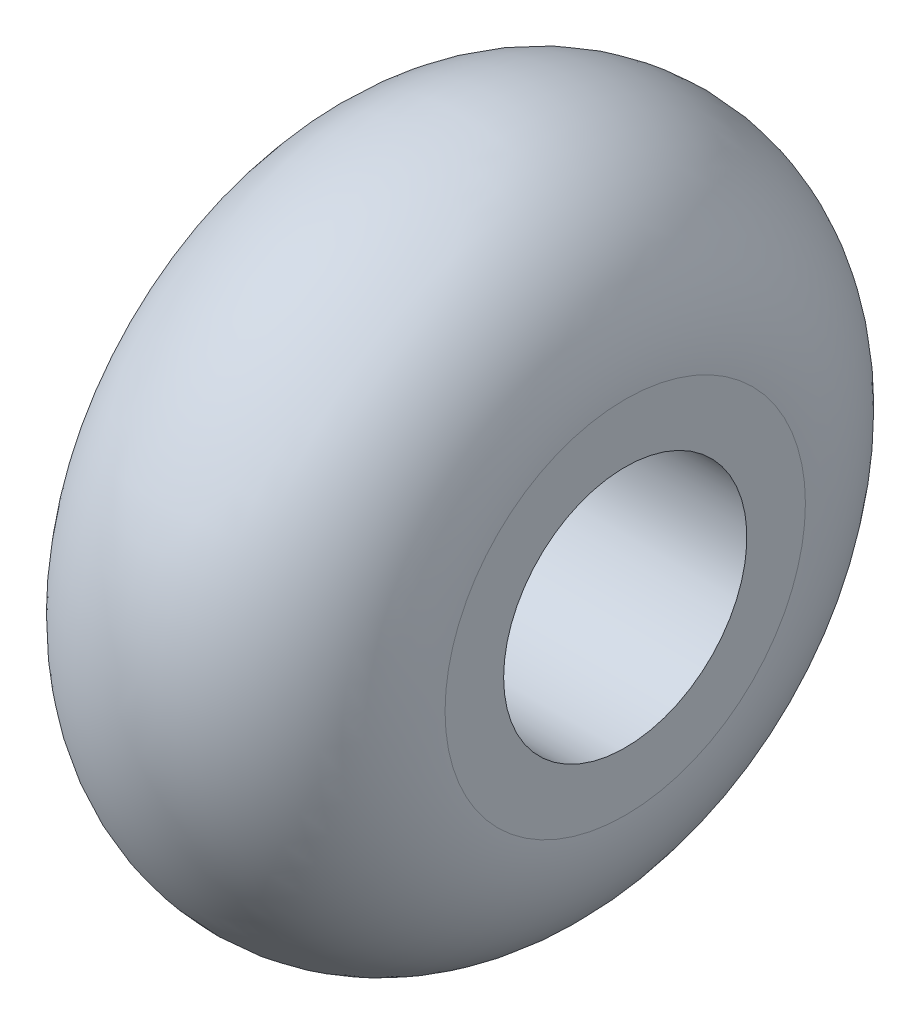
ISO-10303-21;
HEADER;
FILE_DESCRIPTION(('STEP AP214'),'2;1');
FILE_NAME('part.step','',(''),(''),'','','');
FILE_SCHEMA(('AUTOMOTIVE_DESIGN { 1 0 10303 214 1 1 1 1 }'));
ENDSEC;
DATA;
#1=APPLICATION_CONTEXT('core data for automotive mechanical design processes');
#2=APPLICATION_PROTOCOL_DEFINITION('international standard','automotive_design',2000,#1);
#3=PRODUCT_CONTEXT('',#1,'mechanical');
#4=PRODUCT('Part','Part','',(#3));
#5=PRODUCT_RELATED_PRODUCT_CATEGORY('part','',(#4));
#6=PRODUCT_DEFINITION_FORMATION('','',#4);
#7=PRODUCT_DEFINITION_CONTEXT('part definition',#1,'design');
#8=PRODUCT_DEFINITION('design','',#6,#7);
#9=PRODUCT_DEFINITION_SHAPE('','',#8);
#10=(LENGTH_UNIT() NAMED_UNIT(*) SI_UNIT(.MILLI.,.METRE.));
#11=(NAMED_UNIT(*) PLANE_ANGLE_UNIT() SI_UNIT($,.RADIAN.));
#12=(NAMED_UNIT(*) SI_UNIT($,.STERADIAN.) SOLID_ANGLE_UNIT());
#13=UNCERTAINTY_MEASURE_WITH_UNIT(LENGTH_MEASURE(1.E-05),#10,'distance_accuracy_value','');
#14=(GEOMETRIC_REPRESENTATION_CONTEXT(3) GLOBAL_UNCERTAINTY_ASSIGNED_CONTEXT((#13)) GLOBAL_UNIT_ASSIGNED_CONTEXT((#10,
#11,#12)) REPRESENTATION_CONTEXT('',''));
#15=CARTESIAN_POINT('',(0.,0.,0.));
#16=DIRECTION('',(0.,0.,1.));
#17=DIRECTION('',(1.,0.,0.));
#18=AXIS2_PLACEMENT_3D('',#15,#16,#17);
#19=CARTESIAN_POINT('',(0.,4.05,0.));
#20=DIRECTION('',(1.,0.,0.));
#21=DIRECTION('',(0.,0.,-1.));
#22=AXIS2_PLACEMENT_3D('',#19,#20,#21);
#23=PLANE('',#22);
#24=CARTESIAN_POINT('',(0.,0.,0.));
#25=DIRECTION('',(-1.,0.,0.));
#26=DIRECTION('',(0.,0.,1.));
#27=AXIS2_PLACEMENT_3D('',#24,#25,#26);
#28=CIRCLE('',#27,4.05);
#29=CARTESIAN_POINT('',(0.,0.,4.05));
#30=VERTEX_POINT('',#29);
#31=EDGE_CURVE('E56',#30,#30,#28,.T.);
#32=ORIENTED_EDGE('',*,*,#31,.F.);
#33=EDGE_LOOP('',(#32));
#34=FACE_BOUND('',#33,.T.);
#35=CARTESIAN_POINT('',(0.,0.,0.));
#36=DIRECTION('',(-1.,0.,0.));
#37=DIRECTION('',(0.,0.,1.));
#38=AXIS2_PLACEMENT_3D('',#35,#36,#37);
#39=CIRCLE('',#38,6.);
#40=CARTESIAN_POINT('',(0.,0.,6.));
#41=VERTEX_POINT('',#40);
#42=EDGE_CURVE('E10',#41,#41,#39,.T.);
#43=ORIENTED_EDGE('',*,*,#42,.T.);
#44=EDGE_LOOP('',(#43));
#45=FACE_BOUND('',#44,.T.);
#46=ADVANCED_FACE('F39',(#34,#45),#23,.F.);
#47=CARTESIAN_POINT('',(5.5,0.,0.));
#48=DIRECTION('',(-1.,0.,0.));
#49=DIRECTION('',(0.,0.,1.));
#50=AXIS2_PLACEMENT_3D('',#47,#48,#49);
#51=TOROIDAL_SURFACE('',#50,6.,5.5);
#52=ORIENTED_EDGE('',*,*,#42,.F.);
#53=EDGE_LOOP('',(#52));
#54=FACE_BOUND('',#53,.T.);
#55=CARTESIAN_POINT('',(11.,0.,0.));
#56=DIRECTION('',(-1.,0.,0.));
#57=DIRECTION('',(0.,0.,1.));
#58=AXIS2_PLACEMENT_3D('',#55,#56,#57);
#59=CIRCLE('',#58,6.);
#60=CARTESIAN_POINT('',(11.,0.,6.));
#61=VERTEX_POINT('',#60);
#62=EDGE_CURVE('E46',#61,#61,#59,.T.);
#63=ORIENTED_EDGE('',*,*,#62,.T.);
#64=EDGE_LOOP('',(#63));
#65=FACE_BOUND('',#64,.T.);
#66=ADVANCED_FACE('F66',(#54,#65),#51,.T.);
#67=CARTESIAN_POINT('',(11.,4.05,0.));
#68=DIRECTION('',(-1.,0.,0.));
#69=DIRECTION('',(0.,0.,1.));
#70=AXIS2_PLACEMENT_3D('',#67,#68,#69);
#71=PLANE('',#70);
#72=ORIENTED_EDGE('',*,*,#62,.F.);
#73=EDGE_LOOP('',(#72));
#74=FACE_BOUND('',#73,.T.);
#75=CARTESIAN_POINT('',(11.,0.,0.));
#76=DIRECTION('',(-1.,0.,0.));
#77=DIRECTION('',(0.,0.,1.));
#78=AXIS2_PLACEMENT_3D('',#75,#76,#77);
#79=CIRCLE('',#78,4.05);
#80=CARTESIAN_POINT('',(11.,0.,4.05));
#81=VERTEX_POINT('',#80);
#82=EDGE_CURVE('E51',#81,#81,#79,.T.);
#83=ORIENTED_EDGE('',*,*,#82,.T.);
#84=EDGE_LOOP('',(#83));
#85=FACE_BOUND('',#84,.T.);
#86=ADVANCED_FACE('F70',(#74,#85),#71,.F.);
#87=CARTESIAN_POINT('',(0.,0.,0.));
#88=DIRECTION('',(-1.,0.,0.));
#89=DIRECTION('',(0.,0.,1.));
#90=AXIS2_PLACEMENT_3D('',#87,#88,#89);
#91=CYLINDRICAL_SURFACE('',#90,4.05);
#92=ORIENTED_EDGE('',*,*,#82,.F.);
#93=EDGE_LOOP('',(#92));
#94=FACE_BOUND('',#93,.T.);
#95=ORIENTED_EDGE('',*,*,#31,.T.);
#96=EDGE_LOOP('',(#95));
#97=FACE_BOUND('',#96,.T.);
#98=ADVANCED_FACE('F63',(#94,#97),#91,.F.);
#99=CLOSED_SHELL('',(#46,#66,#86,#98));
#100=MANIFOLD_SOLID_BREP('B2',#99);
#101=ADVANCED_BREP_SHAPE_REPRESENTATION('',(#18,#100),#14);
#102=SHAPE_DEFINITION_REPRESENTATION(#9,#101);
ENDSEC;
END-ISO-10303-21;
